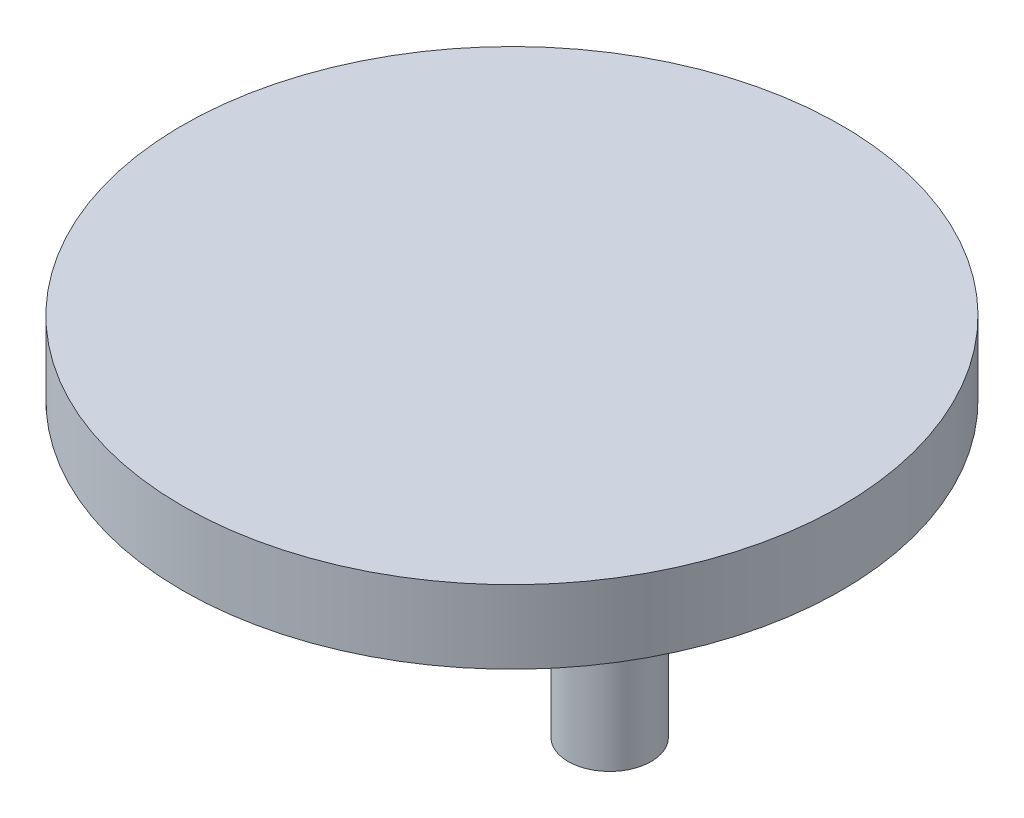
ISO-10303-21;
HEADER;
FILE_DESCRIPTION(('STEP AP214'),'2;1');
FILE_NAME('part.step','',(''),(''),'','','');
FILE_SCHEMA(('AUTOMOTIVE_DESIGN { 1 0 10303 214 1 1 1 1 }'));
ENDSEC;
DATA;
#1=APPLICATION_CONTEXT('core data for automotive mechanical design processes');
#2=APPLICATION_PROTOCOL_DEFINITION('international standard','automotive_design',2000,#1);
#3=PRODUCT_CONTEXT('',#1,'mechanical');
#4=PRODUCT('Part','Part','',(#3));
#5=PRODUCT_RELATED_PRODUCT_CATEGORY('part','',(#4));
#6=PRODUCT_DEFINITION_FORMATION('','',#4);
#7=PRODUCT_DEFINITION_CONTEXT('part definition',#1,'design');
#8=PRODUCT_DEFINITION('design','',#6,#7);
#9=PRODUCT_DEFINITION_SHAPE('','',#8);
#10=(LENGTH_UNIT() NAMED_UNIT(*) SI_UNIT(.MILLI.,.METRE.));
#11=(NAMED_UNIT(*) PLANE_ANGLE_UNIT() SI_UNIT($,.RADIAN.));
#12=(NAMED_UNIT(*) SI_UNIT($,.STERADIAN.) SOLID_ANGLE_UNIT());
#13=UNCERTAINTY_MEASURE_WITH_UNIT(LENGTH_MEASURE(1.E-05),#10,'distance_accuracy_value','');
#14=(GEOMETRIC_REPRESENTATION_CONTEXT(3) GLOBAL_UNCERTAINTY_ASSIGNED_CONTEXT((#13)) GLOBAL_UNIT_ASSIGNED_CONTEXT((#10,
#11,#12)) REPRESENTATION_CONTEXT('',''));
#15=CARTESIAN_POINT('',(0.,0.,0.));
#16=DIRECTION('',(0.,0.,1.));
#17=DIRECTION('',(1.,0.,0.));
#18=AXIS2_PLACEMENT_3D('',#15,#16,#17);
#19=CARTESIAN_POINT('',(0.,6.,0.));
#20=DIRECTION('',(0.,-1.,0.));
#21=DIRECTION('',(0.,0.,-1.));
#22=AXIS2_PLACEMENT_3D('',#19,#20,#21);
#23=CYLINDRICAL_SURFACE('',#22,27.);
#24=CARTESIAN_POINT('',(0.,6.,0.));
#25=DIRECTION('',(0.,1.,0.));
#26=DIRECTION('',(0.,0.,1.));
#27=AXIS2_PLACEMENT_3D('',#24,#25,#26);
#28=CIRCLE('',#27,27.);
#29=CARTESIAN_POINT('',(0.,6.,27.));
#30=VERTEX_POINT('',#29);
#31=EDGE_CURVE('E57',#30,#30,#28,.T.);
#32=ORIENTED_EDGE('',*,*,#31,.F.);
#33=EDGE_LOOP('',(#32));
#34=FACE_BOUND('',#33,.T.);
#35=CARTESIAN_POINT('',(0.,0.,0.));
#36=DIRECTION('',(0.,1.,0.));
#37=DIRECTION('',(0.,0.,1.));
#38=AXIS2_PLACEMENT_3D('',#35,#36,#37);
#39=CIRCLE('',#38,27.);
#40=CARTESIAN_POINT('',(0.,0.,27.));
#41=VERTEX_POINT('',#40);
#42=EDGE_CURVE('E58',#41,#41,#39,.T.);
#43=ORIENTED_EDGE('',*,*,#42,.T.);
#44=EDGE_LOOP('',(#43));
#45=FACE_BOUND('',#44,.T.);
#46=ADVANCED_FACE('F31',(#34,#45),#23,.T.);
#47=CARTESIAN_POINT('',(0.,6.,0.));
#48=DIRECTION('',(0.,1.,0.));
#49=DIRECTION('',(0.,0.,1.));
#50=AXIS2_PLACEMENT_3D('',#47,#48,#49);
#51=PLANE('',#50);
#52=ORIENTED_EDGE('',*,*,#31,.T.);
#53=EDGE_LOOP('',(#52));
#54=FACE_BOUND('',#53,.T.);
#55=ADVANCED_FACE('F92',(#54),#51,.T.);
#56=CARTESIAN_POINT('',(0.,0.,0.));
#57=DIRECTION('',(0.,1.,0.));
#58=DIRECTION('',(0.,0.,1.));
#59=AXIS2_PLACEMENT_3D('',#56,#57,#58);
#60=PLANE('',#59);
#61=CARTESIAN_POINT('',(-18.9443057077841,0.,10.9375000000003));
#62=DIRECTION('',(0.,1.,0.));
#63=DIRECTION('',(0.,0.,1.));
#64=AXIS2_PLACEMENT_3D('',#61,#62,#63);
#65=CIRCLE('',#64,4.40000000000002);
#66=CARTESIAN_POINT('',(-18.9443057077841,0.,15.3375000000003));
#67=VERTEX_POINT('',#66);
#68=EDGE_CURVE('E46',#67,#67,#65,.T.);
#69=ORIENTED_EDGE('',*,*,#68,.T.);
#70=EDGE_LOOP('',(#69));
#71=FACE_BOUND('',#70,.T.);
#72=CARTESIAN_POINT('',(0.,0.,-21.875));
#73=DIRECTION('',(0.,1.,0.));
#74=DIRECTION('',(0.,0.,1.));
#75=AXIS2_PLACEMENT_3D('',#72,#73,#74);
#76=CIRCLE('',#75,4.4);
#77=CARTESIAN_POINT('',(0.,0.,-17.475));
#78=VERTEX_POINT('',#77);
#79=EDGE_CURVE('E51',#78,#78,#76,.T.);
#80=ORIENTED_EDGE('',*,*,#79,.T.);
#81=EDGE_LOOP('',(#80));
#82=FACE_BOUND('',#81,.T.);
#83=CARTESIAN_POINT('',(18.9443057077851,0.,10.9374999999997));
#84=DIRECTION('',(0.,1.,0.));
#85=DIRECTION('',(0.,0.,1.));
#86=AXIS2_PLACEMENT_3D('',#83,#84,#85);
#87=CIRCLE('',#86,4.40000000000002);
#88=CARTESIAN_POINT('',(18.9443057077851,0.,15.3374999999997));
#89=VERTEX_POINT('',#88);
#90=EDGE_CURVE('E54',#89,#89,#87,.T.);
#91=ORIENTED_EDGE('',*,*,#90,.T.);
#92=EDGE_LOOP('',(#91));
#93=FACE_BOUND('',#92,.T.);
#94=ORIENTED_EDGE('',*,*,#42,.F.);
#95=EDGE_LOOP('',(#94));
#96=FACE_BOUND('',#95,.T.);
#97=ADVANCED_FACE('F98',(#71,#82,#93,#96),#60,.F.);
#98=CARTESIAN_POINT('',(18.9443057077851,-9.,10.9374999999997));
#99=DIRECTION('',(0.,1.,0.));
#100=DIRECTION('',(0.,0.,1.));
#101=AXIS2_PLACEMENT_3D('',#98,#99,#100);
#102=CYLINDRICAL_SURFACE('',#101,3.4);
#103=CARTESIAN_POINT('',(18.9443057077851,-1.00000000000002,10.9374999999997));
#104=DIRECTION('',(0.,1.,0.));
#105=DIRECTION('',(0.,0.,1.));
#106=AXIS2_PLACEMENT_3D('',#103,#104,#105);
#107=CIRCLE('',#106,3.4);
#108=CARTESIAN_POINT('',(18.9443057077851,-1.00000000000002,14.3374999999997));
#109=VERTEX_POINT('',#108);
#110=EDGE_CURVE('E10',#109,#109,#107,.F.);
#111=ORIENTED_EDGE('',*,*,#110,.T.);
#112=EDGE_LOOP('',(#111));
#113=FACE_BOUND('',#112,.T.);
#114=CARTESIAN_POINT('',(18.9443057077851,-9.,10.9374999999997));
#115=DIRECTION('',(0.,1.,0.));
#116=DIRECTION('',(0.,0.,1.));
#117=AXIS2_PLACEMENT_3D('',#114,#115,#116);
#118=CIRCLE('',#117,3.4);
#119=CARTESIAN_POINT('',(18.9443057077851,-9.,14.3374999999997));
#120=VERTEX_POINT('',#119);
#121=EDGE_CURVE('E61',#120,#120,#118,.T.);
#122=ORIENTED_EDGE('',*,*,#121,.T.);
#123=EDGE_LOOP('',(#122));
#124=FACE_BOUND('',#123,.T.);
#125=ADVANCED_FACE('F115',(#113,#124),#102,.T.);
#126=CARTESIAN_POINT('',(0.,-9.,0.));
#127=DIRECTION('',(0.,1.,0.));
#128=DIRECTION('',(0.,0.,1.));
#129=AXIS2_PLACEMENT_3D('',#126,#127,#128);
#130=PLANE('',#129);
#131=ORIENTED_EDGE('',*,*,#121,.F.);
#132=EDGE_LOOP('',(#131));
#133=FACE_BOUND('',#132,.T.);
#134=ADVANCED_FACE('F124',(#133),#130,.F.);
#135=CARTESIAN_POINT('',(0.,-9.,-21.875));
#136=DIRECTION('',(0.,1.,0.));
#137=DIRECTION('',(0.,0.,1.));
#138=AXIS2_PLACEMENT_3D('',#135,#136,#137);
#139=CYLINDRICAL_SURFACE('',#138,3.4);
#140=CARTESIAN_POINT('',(0.,-0.999999999999989,-21.875));
#141=DIRECTION('',(0.,1.,0.));
#142=DIRECTION('',(0.,0.,1.));
#143=AXIS2_PLACEMENT_3D('',#140,#141,#142);
#144=CIRCLE('',#143,3.4);
#145=CARTESIAN_POINT('',(0.,-0.999999999999989,-18.475));
#146=VERTEX_POINT('',#145);
#147=EDGE_CURVE('E38',#146,#146,#144,.F.);
#148=ORIENTED_EDGE('',*,*,#147,.T.);
#149=EDGE_LOOP('',(#148));
#150=FACE_BOUND('',#149,.T.);
#151=CARTESIAN_POINT('',(0.,-9.,-21.875));
#152=DIRECTION('',(0.,1.,0.));
#153=DIRECTION('',(0.,0.,1.));
#154=AXIS2_PLACEMENT_3D('',#151,#152,#153);
#155=CIRCLE('',#154,3.4);
#156=CARTESIAN_POINT('',(0.,-9.,-18.475));
#157=VERTEX_POINT('',#156);
#158=EDGE_CURVE('E66',#157,#157,#155,.T.);
#159=ORIENTED_EDGE('',*,*,#158,.T.);
#160=EDGE_LOOP('',(#159));
#161=FACE_BOUND('',#160,.T.);
#162=ADVANCED_FACE('F132',(#150,#161),#139,.T.);
#163=CARTESIAN_POINT('',(0.,-9.,0.));
#164=DIRECTION('',(0.,1.,0.));
#165=DIRECTION('',(0.,0.,1.));
#166=AXIS2_PLACEMENT_3D('',#163,#164,#165);
#167=PLANE('',#166);
#168=ORIENTED_EDGE('',*,*,#158,.F.);
#169=EDGE_LOOP('',(#168));
#170=FACE_BOUND('',#169,.T.);
#171=ADVANCED_FACE('F87',(#170),#167,.F.);
#172=CARTESIAN_POINT('',(-18.9443057077841,-9.,10.9375000000003));
#173=DIRECTION('',(0.,1.,0.));
#174=DIRECTION('',(0.,0.,1.));
#175=AXIS2_PLACEMENT_3D('',#172,#173,#174);
#176=CYLINDRICAL_SURFACE('',#175,3.4);
#177=CARTESIAN_POINT('',(-18.9443057077841,-1.00000000000002,10.9375000000003));
#178=DIRECTION('',(0.,1.,0.));
#179=DIRECTION('',(0.,0.,1.));
#180=AXIS2_PLACEMENT_3D('',#177,#178,#179);
#181=CIRCLE('',#180,3.4);
#182=CARTESIAN_POINT('',(-18.9443057077841,-1.00000000000002,14.3375000000003));
#183=VERTEX_POINT('',#182);
#184=EDGE_CURVE('E42',#183,#183,#181,.F.);
#185=ORIENTED_EDGE('',*,*,#184,.T.);
#186=EDGE_LOOP('',(#185));
#187=FACE_BOUND('',#186,.T.);
#188=CARTESIAN_POINT('',(-18.9443057077841,-9.,10.9375000000003));
#189=DIRECTION('',(0.,1.,0.));
#190=DIRECTION('',(0.,0.,1.));
#191=AXIS2_PLACEMENT_3D('',#188,#189,#190);
#192=CIRCLE('',#191,3.4);
#193=CARTESIAN_POINT('',(-18.9443057077841,-9.,14.3375000000003));
#194=VERTEX_POINT('',#193);
#195=EDGE_CURVE('E69',#194,#194,#192,.T.);
#196=ORIENTED_EDGE('',*,*,#195,.T.);
#197=EDGE_LOOP('',(#196));
#198=FACE_BOUND('',#197,.T.);
#199=ADVANCED_FACE('F73',(#187,#198),#176,.T.);
#200=CARTESIAN_POINT('',(-18.9443057077841,-9.,10.9375000000003));
#201=DIRECTION('',(0.,1.,0.));
#202=DIRECTION('',(0.,0.,1.));
#203=AXIS2_PLACEMENT_3D('',#200,#201,#202);
#204=PLANE('',#203);
#205=ORIENTED_EDGE('',*,*,#195,.F.);
#206=EDGE_LOOP('',(#205));
#207=FACE_BOUND('',#206,.T.);
#208=ADVANCED_FACE('F75',(#207),#204,.F.);
#209=CARTESIAN_POINT('',(-18.9443057077841,0.,10.9375000000003));
#210=DIRECTION('',(0.,1.,0.));
#211=DIRECTION('',(0.,0.,1.));
#212=AXIS2_PLACEMENT_3D('',#209,#210,#211);
#213=CONICAL_SURFACE('',#212,4.40000000000002,0.785398163397451);
#214=ORIENTED_EDGE('',*,*,#184,.F.);
#215=EDGE_LOOP('',(#214));
#216=FACE_BOUND('',#215,.T.);
#217=ORIENTED_EDGE('',*,*,#68,.F.);
#218=EDGE_LOOP('',(#217));
#219=FACE_BOUND('',#218,.T.);
#220=ADVANCED_FACE('F77',(#216,#219),#213,.T.);
#221=CARTESIAN_POINT('',(0.,0.,-21.875));
#222=DIRECTION('',(0.,1.,0.));
#223=DIRECTION('',(0.,0.,1.));
#224=AXIS2_PLACEMENT_3D('',#221,#222,#223);
#225=CONICAL_SURFACE('',#224,4.4,0.785398163397455);
#226=ORIENTED_EDGE('',*,*,#147,.F.);
#227=EDGE_LOOP('',(#226));
#228=FACE_BOUND('',#227,.T.);
#229=ORIENTED_EDGE('',*,*,#79,.F.);
#230=EDGE_LOOP('',(#229));
#231=FACE_BOUND('',#230,.T.);
#232=ADVANCED_FACE('F83',(#228,#231),#225,.T.);
#233=CARTESIAN_POINT('',(18.9443057077851,0.,10.9374999999997));
#234=DIRECTION('',(0.,1.,0.));
#235=DIRECTION('',(0.,0.,1.));
#236=AXIS2_PLACEMENT_3D('',#233,#234,#235);
#237=CONICAL_SURFACE('',#236,4.40000000000002,0.785398163397451);
#238=ORIENTED_EDGE('',*,*,#110,.F.);
#239=EDGE_LOOP('',(#238));
#240=FACE_BOUND('',#239,.T.);
#241=ORIENTED_EDGE('',*,*,#90,.F.);
#242=EDGE_LOOP('',(#241));
#243=FACE_BOUND('',#242,.T.);
#244=ADVANCED_FACE('F33',(#240,#243),#237,.T.);
#245=CLOSED_SHELL('',(#46,#55,#97,#125,#134,#162,#171,#199,#208,#220,#232,#244));
#246=MANIFOLD_SOLID_BREP('B2',#245);
#247=ADVANCED_BREP_SHAPE_REPRESENTATION('',(#18,#246),#14);
#248=SHAPE_DEFINITION_REPRESENTATION(#9,#247);
ENDSEC;
END-ISO-10303-21;
